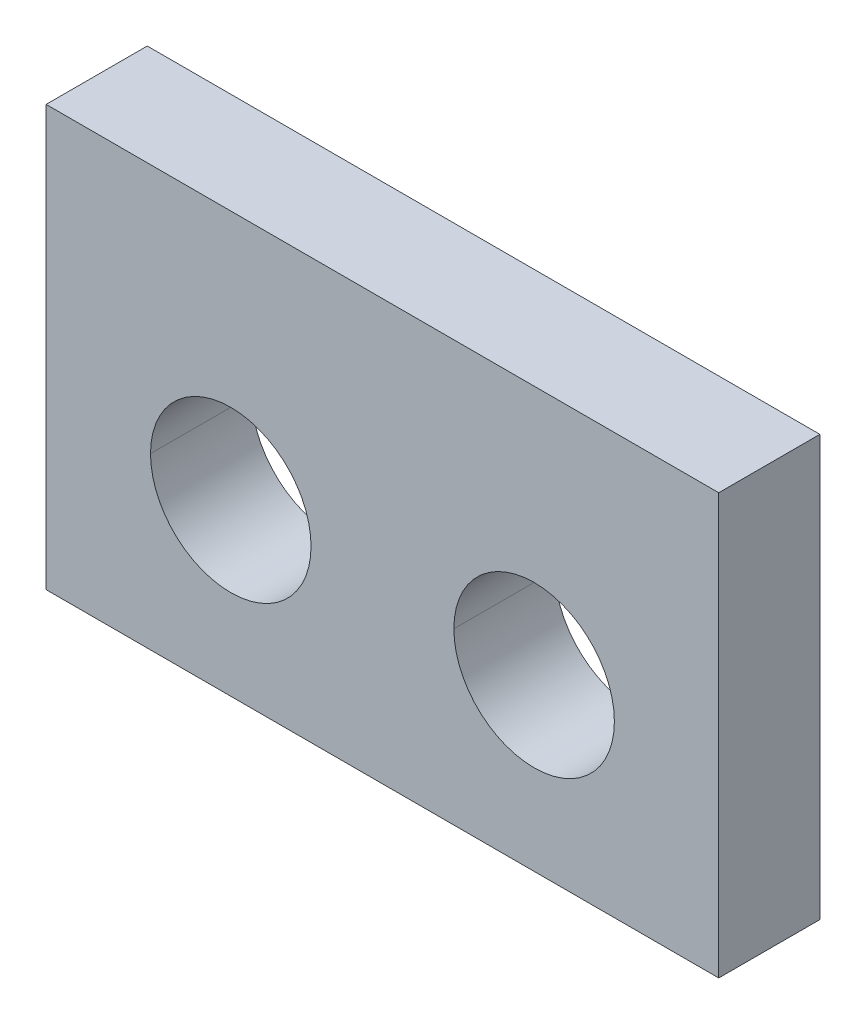
ISO-10303-21;
HEADER;
FILE_DESCRIPTION(('STEP AP214'),'2;1');
FILE_NAME('part.step','',(''),(''),'','','');
FILE_SCHEMA(('AUTOMOTIVE_DESIGN { 1 0 10303 214 1 1 1 1 }'));
ENDSEC;
DATA;
#1=APPLICATION_CONTEXT('core data for automotive mechanical design processes');
#2=APPLICATION_PROTOCOL_DEFINITION('international standard','automotive_design',2000,#1);
#3=PRODUCT_CONTEXT('',#1,'mechanical');
#4=PRODUCT('Part','Part','',(#3));
#5=PRODUCT_RELATED_PRODUCT_CATEGORY('part','',(#4));
#6=PRODUCT_DEFINITION_FORMATION('','',#4);
#7=PRODUCT_DEFINITION_CONTEXT('part definition',#1,'design');
#8=PRODUCT_DEFINITION('design','',#6,#7);
#9=PRODUCT_DEFINITION_SHAPE('','',#8);
#10=(LENGTH_UNIT() NAMED_UNIT(*) SI_UNIT(.MILLI.,.METRE.));
#11=(NAMED_UNIT(*) PLANE_ANGLE_UNIT() SI_UNIT($,.RADIAN.));
#12=(NAMED_UNIT(*) SI_UNIT($,.STERADIAN.) SOLID_ANGLE_UNIT());
#13=UNCERTAINTY_MEASURE_WITH_UNIT(LENGTH_MEASURE(1.E-05),#10,'distance_accuracy_value','');
#14=(GEOMETRIC_REPRESENTATION_CONTEXT(3) GLOBAL_UNCERTAINTY_ASSIGNED_CONTEXT((#13)) GLOBAL_UNIT_ASSIGNED_CONTEXT((#10,
#11,#12)) REPRESENTATION_CONTEXT('',''));
#15=CARTESIAN_POINT('',(0.,0.,0.));
#16=DIRECTION('',(0.,0.,1.));
#17=DIRECTION('',(1.,0.,0.));
#18=AXIS2_PLACEMENT_3D('',#15,#16,#17);
#19=CARTESIAN_POINT('',(5.334010668021,-7.067551435103,1.600028244856));
#20=DIRECTION('',(0.,0.,-1.));
#21=DIRECTION('',(0.,-1.,0.));
#22=AXIS2_PLACEMENT_3D('',#19,#20,#21);
#23=PLANE('',#22);
#24=CARTESIAN_POINT('',(7.733909067818,-7.702692405385,1.600028244856));
#25=DIRECTION('',(0.,0.,1.));
#26=DIRECTION('',(-1.,0.,0.));
#27=AXIS2_PLACEMENT_3D('',#24,#25,#26);
#28=CIRCLE('',#27,1.270002540005);
#29=CARTESIAN_POINT('',(6.463906527813,-7.702692405385,1.600028244856));
#30=VERTEX_POINT('',#29);
#31=CARTESIAN_POINT('',(9.003911607823,-7.702692405385,1.600028244856));
#32=VERTEX_POINT('',#31);
#33=EDGE_CURVE('E28',#30,#32,#28,.T.);
#34=ORIENTED_EDGE('',*,*,#33,.F.);
#35=CARTESIAN_POINT('',(7.733909067818,-7.702692405385,1.600028244856));
#36=DIRECTION('',(0.,0.,1.));
#37=DIRECTION('',(1.,0.,0.));
#38=AXIS2_PLACEMENT_3D('',#35,#36,#37);
#39=CIRCLE('',#38,1.270002540005);
#40=EDGE_CURVE('E170',#32,#30,#39,.T.);
#41=ORIENTED_EDGE('',*,*,#40,.F.);
#42=EDGE_LOOP('',(#34,#41));
#43=FACE_BOUND('',#42,.T.);
#44=CARTESIAN_POINT('',(2.934213868428,-7.702692405385,1.600028244856));
#45=DIRECTION('',(0.,0.,1.));
#46=DIRECTION('',(-1.,0.,0.));
#47=AXIS2_PLACEMENT_3D('',#44,#45,#46);
#48=CIRCLE('',#47,1.270002540005);
#49=CARTESIAN_POINT('',(1.664211328423,-7.702692405385,1.600028244856));
#50=VERTEX_POINT('',#49);
#51=CARTESIAN_POINT('',(4.204216408433,-7.702692405385,1.600028244856));
#52=VERTEX_POINT('',#51);
#53=EDGE_CURVE('E103',#50,#52,#48,.T.);
#54=ORIENTED_EDGE('',*,*,#53,.F.);
#55=CARTESIAN_POINT('',(2.934213868428,-7.702692405385,1.600028244856));
#56=DIRECTION('',(0.,0.,1.));
#57=DIRECTION('',(1.,0.,0.));
#58=AXIS2_PLACEMENT_3D('',#55,#56,#57);
#59=CIRCLE('',#58,1.270002540005);
#60=EDGE_CURVE('E159',#52,#50,#59,.T.);
#61=ORIENTED_EDGE('',*,*,#60,.F.);
#62=EDGE_LOOP('',(#54,#61));
#63=FACE_BOUND('',#62,.T.);
#64=DIRECTION('',(0.,1.,0.));
#65=VECTOR('',#64,1.);
#66=CARTESIAN_POINT('',(0.01270002540005,-10.39240538481,1.600028244856));
#67=LINE('',#66,#65);
#68=CARTESIAN_POINT('',(0.01270002540005,-10.39240538481,1.600028244856));
#69=VERTEX_POINT('',#68);
#70=CARTESIAN_POINT('',(0.01270002540005,-3.742697485395,1.600028244856));
#71=VERTEX_POINT('',#70);
#72=EDGE_CURVE('E91',#69,#71,#67,.T.);
#73=ORIENTED_EDGE('',*,*,#72,.F.);
#74=DIRECTION('',(-1.,0.,0.));
#75=VECTOR('',#74,1.);
#76=CARTESIAN_POINT('',(10.655321310643,-10.39240538481,1.600028244856));
#77=LINE('',#76,#75);
#78=CARTESIAN_POINT('',(10.655321310643,-10.39240538481,1.600028244856));
#79=VERTEX_POINT('',#78);
#80=EDGE_CURVE('E139',#79,#69,#77,.T.);
#81=ORIENTED_EDGE('',*,*,#80,.F.);
#82=DIRECTION('',(0.,-1.,0.));
#83=VECTOR('',#82,1.);
#84=CARTESIAN_POINT('',(10.655321310643,-3.742697485395,1.600028244856));
#85=LINE('',#84,#83);
#86=CARTESIAN_POINT('',(10.655321310643,-3.742697485395,1.600028244856));
#87=VERTEX_POINT('',#86);
#88=EDGE_CURVE('E80',#87,#79,#85,.T.);
#89=ORIENTED_EDGE('',*,*,#88,.F.);
#90=DIRECTION('',(1.,0.,0.));
#91=VECTOR('',#90,1.);
#92=CARTESIAN_POINT('',(0.01270002540005,-3.742697485395,1.600028244856));
#93=LINE('',#92,#91);
#94=EDGE_CURVE('E154',#71,#87,#93,.T.);
#95=ORIENTED_EDGE('',*,*,#94,.F.);
#96=EDGE_LOOP('',(#73,#81,#89,#95));
#97=FACE_BOUND('',#96,.T.);
#98=ADVANCED_FACE('F17',(#43,#63,#97),#23,.F.);
#99=CARTESIAN_POINT('',(5.334010668021,-7.067551435103,0.));
#100=DIRECTION('',(0.,0.,-1.));
#101=DIRECTION('',(0.,-1.,0.));
#102=AXIS2_PLACEMENT_3D('',#99,#100,#101);
#103=PLANE('',#102);
#104=CARTESIAN_POINT('',(7.733909067818,-7.702692405385,0.));
#105=DIRECTION('',(0.,0.,1.));
#106=DIRECTION('',(1.,0.,0.));
#107=AXIS2_PLACEMENT_3D('',#104,#105,#106);
#108=CIRCLE('',#107,1.270002540005);
#109=CARTESIAN_POINT('',(9.003911607823,-7.702692405385,0.));
#110=VERTEX_POINT('',#109);
#111=CARTESIAN_POINT('',(6.463906527813,-7.702692405385,0.));
#112=VERTEX_POINT('',#111);
#113=EDGE_CURVE('E179',#110,#112,#108,.T.);
#114=ORIENTED_EDGE('',*,*,#113,.T.);
#115=CARTESIAN_POINT('',(7.733909067818,-7.702692405385,0.));
#116=DIRECTION('',(0.,0.,1.));
#117=DIRECTION('',(-1.,0.,0.));
#118=AXIS2_PLACEMENT_3D('',#115,#116,#117);
#119=CIRCLE('',#118,1.270002540005);
#120=EDGE_CURVE('E11',#112,#110,#119,.T.);
#121=ORIENTED_EDGE('',*,*,#120,.T.);
#122=EDGE_LOOP('',(#114,#121));
#123=FACE_BOUND('',#122,.T.);
#124=CARTESIAN_POINT('',(2.934213868428,-7.702692405385,0.));
#125=DIRECTION('',(0.,0.,1.));
#126=DIRECTION('',(1.,0.,0.));
#127=AXIS2_PLACEMENT_3D('',#124,#125,#126);
#128=CIRCLE('',#127,1.270002540005);
#129=CARTESIAN_POINT('',(4.204216408433,-7.702692405385,0.));
#130=VERTEX_POINT('',#129);
#131=CARTESIAN_POINT('',(1.664211328423,-7.702692405385,0.));
#132=VERTEX_POINT('',#131);
#133=EDGE_CURVE('E188',#130,#132,#128,.T.);
#134=ORIENTED_EDGE('',*,*,#133,.T.);
#135=CARTESIAN_POINT('',(2.934213868428,-7.702692405385,0.));
#136=DIRECTION('',(0.,0.,1.));
#137=DIRECTION('',(-1.,0.,0.));
#138=AXIS2_PLACEMENT_3D('',#135,#136,#137);
#139=CIRCLE('',#138,1.270002540005);
#140=EDGE_CURVE('E171',#132,#130,#139,.T.);
#141=ORIENTED_EDGE('',*,*,#140,.T.);
#142=EDGE_LOOP('',(#134,#141));
#143=FACE_BOUND('',#142,.T.);
#144=DIRECTION('',(1.,0.,0.));
#145=VECTOR('',#144,1.);
#146=CARTESIAN_POINT('',(0.01270002540005,-3.742697485395,0.));
#147=LINE('',#146,#145);
#148=CARTESIAN_POINT('',(0.01270002540005,-3.742697485395,0.));
#149=VERTEX_POINT('',#148);
#150=CARTESIAN_POINT('',(10.655321310643,-3.742697485395,0.));
#151=VERTEX_POINT('',#150);
#152=EDGE_CURVE('E185',#149,#151,#147,.T.);
#153=ORIENTED_EDGE('',*,*,#152,.T.);
#154=DIRECTION('',(0.,-1.,0.));
#155=VECTOR('',#154,1.);
#156=CARTESIAN_POINT('',(10.655321310643,-3.742697485395,0.));
#157=LINE('',#156,#155);
#158=CARTESIAN_POINT('',(10.655321310643,-10.39240538481,0.));
#159=VERTEX_POINT('',#158);
#160=EDGE_CURVE('E69',#151,#159,#157,.T.);
#161=ORIENTED_EDGE('',*,*,#160,.T.);
#162=DIRECTION('',(-1.,0.,0.));
#163=VECTOR('',#162,1.);
#164=CARTESIAN_POINT('',(10.655321310643,-10.39240538481,0.));
#165=LINE('',#164,#163);
#166=CARTESIAN_POINT('',(0.01270002540005,-10.39240538481,0.));
#167=VERTEX_POINT('',#166);
#168=EDGE_CURVE('E133',#159,#167,#165,.T.);
#169=ORIENTED_EDGE('',*,*,#168,.T.);
#170=DIRECTION('',(0.,1.,0.));
#171=VECTOR('',#170,1.);
#172=CARTESIAN_POINT('',(0.01270002540005,-10.39240538481,0.));
#173=LINE('',#172,#171);
#174=EDGE_CURVE('E121',#167,#149,#173,.T.);
#175=ORIENTED_EDGE('',*,*,#174,.T.);
#176=EDGE_LOOP('',(#153,#161,#169,#175));
#177=FACE_BOUND('',#176,.T.);
#178=ADVANCED_FACE('F19',(#123,#143,#177),#103,.T.);
#179=CARTESIAN_POINT('',(7.733909067818,-7.702692405385,0.));
#180=DIRECTION('',(0.,0.,-1.));
#181=DIRECTION('',(-1.,0.,0.));
#182=AXIS2_PLACEMENT_3D('',#179,#180,#181);
#183=CYLINDRICAL_SURFACE('',#182,1.270002540005);
#184=DIRECTION('',(0.,0.,1.));
#185=VECTOR('',#184,1.);
#186=CARTESIAN_POINT('',(6.463906527813,-7.702692405385,0.));
#187=LINE('',#186,#185);
#188=EDGE_CURVE('E177',#112,#30,#187,.T.);
#189=ORIENTED_EDGE('',*,*,#188,.T.);
#190=ORIENTED_EDGE('',*,*,#33,.T.);
#191=DIRECTION('',(0.,0.,1.));
#192=VECTOR('',#191,1.);
#193=CARTESIAN_POINT('',(9.003911607823,-7.702692405385,0.));
#194=LINE('',#193,#192);
#195=EDGE_CURVE('E166',#110,#32,#194,.T.);
#196=ORIENTED_EDGE('',*,*,#195,.F.);
#197=ORIENTED_EDGE('',*,*,#120,.F.);
#198=EDGE_LOOP('',(#189,#190,#196,#197));
#199=FACE_BOUND('',#198,.T.);
#200=ADVANCED_FACE('F295',(#199),#183,.F.);
#201=CARTESIAN_POINT('',(7.733909067818,-7.702692405385,0.));
#202=DIRECTION('',(0.,0.,-1.));
#203=DIRECTION('',(1.,0.,0.));
#204=AXIS2_PLACEMENT_3D('',#201,#202,#203);
#205=CYLINDRICAL_SURFACE('',#204,1.270002540005);
#206=ORIENTED_EDGE('',*,*,#195,.T.);
#207=ORIENTED_EDGE('',*,*,#40,.T.);
#208=ORIENTED_EDGE('',*,*,#188,.F.);
#209=ORIENTED_EDGE('',*,*,#113,.F.);
#210=EDGE_LOOP('',(#206,#207,#208,#209));
#211=FACE_BOUND('',#210,.T.);
#212=ADVANCED_FACE('F311',(#211),#205,.F.);
#213=CARTESIAN_POINT('',(2.934213868428,-7.702692405385,0.));
#214=DIRECTION('',(0.,0.,-1.));
#215=DIRECTION('',(-1.,0.,0.));
#216=AXIS2_PLACEMENT_3D('',#213,#214,#215);
#217=CYLINDRICAL_SURFACE('',#216,1.270002540005);
#218=DIRECTION('',(0.,0.,1.));
#219=VECTOR('',#218,1.);
#220=CARTESIAN_POINT('',(1.664211328423,-7.702692405385,0.));
#221=LINE('',#220,#219);
#222=EDGE_CURVE('E163',#132,#50,#221,.T.);
#223=ORIENTED_EDGE('',*,*,#222,.T.);
#224=ORIENTED_EDGE('',*,*,#53,.T.);
#225=DIRECTION('',(0.,0.,1.));
#226=VECTOR('',#225,1.);
#227=CARTESIAN_POINT('',(4.204216408433,-7.702692405385,0.));
#228=LINE('',#227,#226);
#229=EDGE_CURVE('E131',#130,#52,#228,.T.);
#230=ORIENTED_EDGE('',*,*,#229,.F.);
#231=ORIENTED_EDGE('',*,*,#140,.F.);
#232=EDGE_LOOP('',(#223,#224,#230,#231));
#233=FACE_BOUND('',#232,.T.);
#234=ADVANCED_FACE('F299',(#233),#217,.F.);
#235=CARTESIAN_POINT('',(2.934213868428,-7.702692405385,0.));
#236=DIRECTION('',(0.,0.,-1.));
#237=DIRECTION('',(1.,0.,0.));
#238=AXIS2_PLACEMENT_3D('',#235,#236,#237);
#239=CYLINDRICAL_SURFACE('',#238,1.270002540005);
#240=ORIENTED_EDGE('',*,*,#229,.T.);
#241=ORIENTED_EDGE('',*,*,#60,.T.);
#242=ORIENTED_EDGE('',*,*,#222,.F.);
#243=ORIENTED_EDGE('',*,*,#133,.F.);
#244=EDGE_LOOP('',(#240,#241,#242,#243));
#245=FACE_BOUND('',#244,.T.);
#246=ADVANCED_FACE('F301',(#245),#239,.F.);
#247=CARTESIAN_POINT('',(0.01270002540005,-10.39240538481,0.));
#248=DIRECTION('',(-1.,0.,0.));
#249=DIRECTION('',(0.,0.,1.));
#250=AXIS2_PLACEMENT_3D('',#247,#248,#249);
#251=PLANE('',#250);
#252=DIRECTION('',(0.,0.,1.));
#253=VECTOR('',#252,1.);
#254=CARTESIAN_POINT('',(0.01270002540005,-10.39240538481,0.));
#255=LINE('',#254,#253);
#256=EDGE_CURVE('E21',#167,#69,#255,.T.);
#257=ORIENTED_EDGE('',*,*,#256,.T.);
#258=ORIENTED_EDGE('',*,*,#72,.T.);
#259=DIRECTION('',(0.,0.,1.));
#260=VECTOR('',#259,1.);
#261=CARTESIAN_POINT('',(0.01270002540005,-3.742697485395,0.));
#262=LINE('',#261,#260);
#263=EDGE_CURVE('E127',#149,#71,#262,.T.);
#264=ORIENTED_EDGE('',*,*,#263,.F.);
#265=ORIENTED_EDGE('',*,*,#174,.F.);
#266=EDGE_LOOP('',(#257,#258,#264,#265));
#267=FACE_BOUND('',#266,.T.);
#268=ADVANCED_FACE('F123',(#267),#251,.T.);
#269=CARTESIAN_POINT('',(10.655321310643,-10.39240538481,0.));
#270=DIRECTION('',(0.,-1.,0.));
#271=DIRECTION('',(0.,0.,-1.));
#272=AXIS2_PLACEMENT_3D('',#269,#270,#271);
#273=PLANE('',#272);
#274=DIRECTION('',(0.,0.,1.));
#275=VECTOR('',#274,1.);
#276=CARTESIAN_POINT('',(10.655321310643,-10.39240538481,0.));
#277=LINE('',#276,#275);
#278=EDGE_CURVE('E149',#159,#79,#277,.T.);
#279=ORIENTED_EDGE('',*,*,#278,.T.);
#280=ORIENTED_EDGE('',*,*,#80,.T.);
#281=ORIENTED_EDGE('',*,*,#256,.F.);
#282=ORIENTED_EDGE('',*,*,#168,.F.);
#283=EDGE_LOOP('',(#279,#280,#281,#282));
#284=FACE_BOUND('',#283,.T.);
#285=ADVANCED_FACE('F138',(#284),#273,.T.);
#286=CARTESIAN_POINT('',(10.655321310643,-3.742697485395,0.));
#287=DIRECTION('',(1.,0.,0.));
#288=DIRECTION('',(0.,1.,0.));
#289=AXIS2_PLACEMENT_3D('',#286,#287,#288);
#290=PLANE('',#289);
#291=DIRECTION('',(0.,0.,1.));
#292=VECTOR('',#291,1.);
#293=CARTESIAN_POINT('',(10.655321310643,-3.742697485395,0.));
#294=LINE('',#293,#292);
#295=EDGE_CURVE('E158',#151,#87,#294,.T.);
#296=ORIENTED_EDGE('',*,*,#295,.T.);
#297=ORIENTED_EDGE('',*,*,#88,.T.);
#298=ORIENTED_EDGE('',*,*,#278,.F.);
#299=ORIENTED_EDGE('',*,*,#160,.F.);
#300=EDGE_LOOP('',(#296,#297,#298,#299));
#301=FACE_BOUND('',#300,.T.);
#302=ADVANCED_FACE('F276',(#301),#290,.T.);
#303=CARTESIAN_POINT('',(0.01270002540005,-3.742697485395,0.));
#304=DIRECTION('',(0.,1.,0.));
#305=DIRECTION('',(1.,0.,0.));
#306=AXIS2_PLACEMENT_3D('',#303,#304,#305);
#307=PLANE('',#306);
#308=ORIENTED_EDGE('',*,*,#263,.T.);
#309=ORIENTED_EDGE('',*,*,#94,.T.);
#310=ORIENTED_EDGE('',*,*,#295,.F.);
#311=ORIENTED_EDGE('',*,*,#152,.F.);
#312=EDGE_LOOP('',(#308,#309,#310,#311));
#313=FACE_BOUND('',#312,.T.);
#314=ADVANCED_FACE('F275',(#313),#307,.T.);
#315=CLOSED_SHELL('',(#98,#178,#200,#212,#234,#246,#268,#285,#302,#314));
#316=MANIFOLD_SOLID_BREP('B1',#315);
#317=ADVANCED_BREP_SHAPE_REPRESENTATION('',(#18,#316),#14);
#318=SHAPE_DEFINITION_REPRESENTATION(#9,#317);
ENDSEC;
END-ISO-10303-21;
